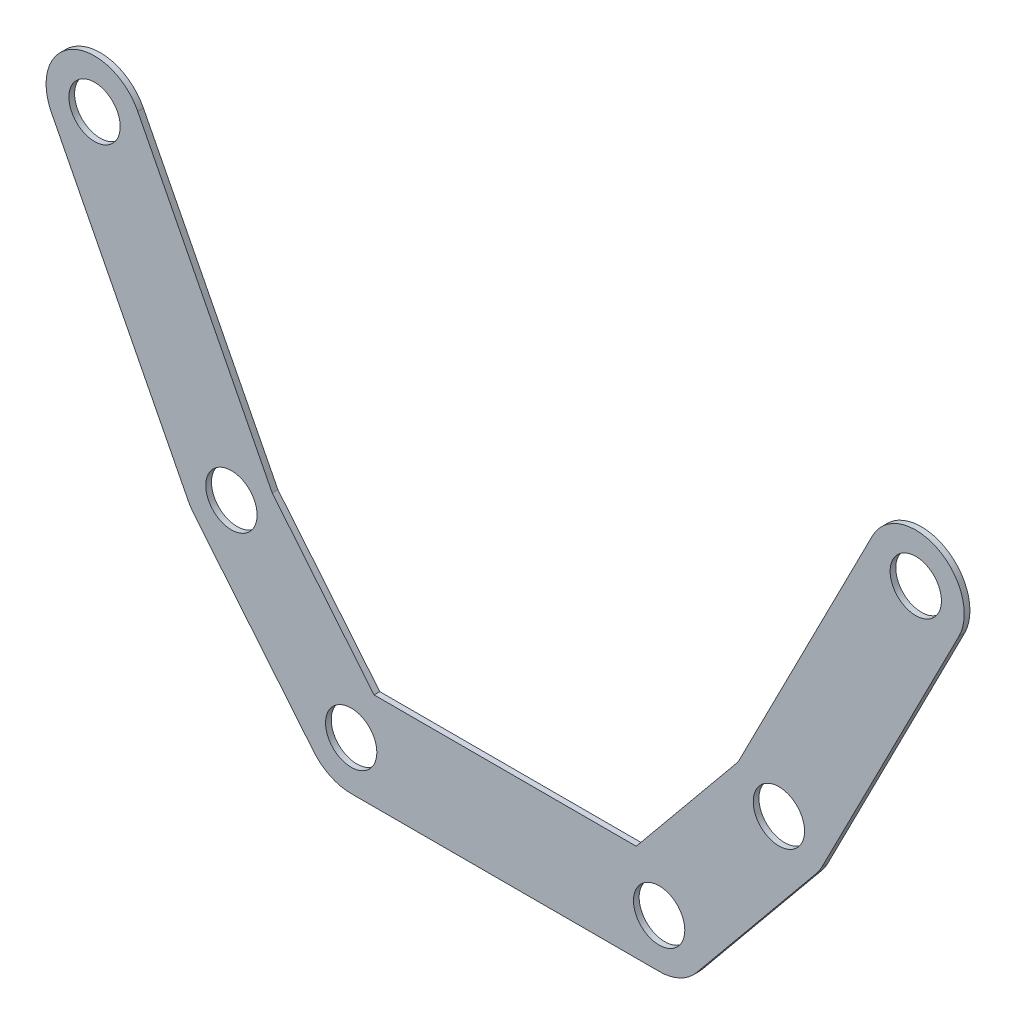
ISO-10303-21;
HEADER;
FILE_DESCRIPTION(('STEP AP214'),'2;1');
FILE_NAME('part.step','',(''),(''),'','','');
FILE_SCHEMA(('AUTOMOTIVE_DESIGN { 1 0 10303 214 1 1 1 1 }'));
ENDSEC;
DATA;
#1=APPLICATION_CONTEXT('core data for automotive mechanical design processes');
#2=APPLICATION_PROTOCOL_DEFINITION('international standard','automotive_design',2000,#1);
#3=PRODUCT_CONTEXT('',#1,'mechanical');
#4=PRODUCT('Part','Part','',(#3));
#5=PRODUCT_RELATED_PRODUCT_CATEGORY('part','',(#4));
#6=PRODUCT_DEFINITION_FORMATION('','',#4);
#7=PRODUCT_DEFINITION_CONTEXT('part definition',#1,'design');
#8=PRODUCT_DEFINITION('design','',#6,#7);
#9=PRODUCT_DEFINITION_SHAPE('','',#8);
#10=(LENGTH_UNIT() NAMED_UNIT(*) SI_UNIT(.MILLI.,.METRE.));
#11=(NAMED_UNIT(*) PLANE_ANGLE_UNIT() SI_UNIT($,.RADIAN.));
#12=(NAMED_UNIT(*) SI_UNIT($,.STERADIAN.) SOLID_ANGLE_UNIT());
#13=UNCERTAINTY_MEASURE_WITH_UNIT(LENGTH_MEASURE(1.E-05),#10,'distance_accuracy_value','');
#14=(GEOMETRIC_REPRESENTATION_CONTEXT(3) GLOBAL_UNCERTAINTY_ASSIGNED_CONTEXT((#13)) GLOBAL_UNIT_ASSIGNED_CONTEXT((#10,
#11,#12)) REPRESENTATION_CONTEXT('',''));
#15=CARTESIAN_POINT('',(0.,0.,0.));
#16=DIRECTION('',(0.,0.,1.));
#17=DIRECTION('',(1.,0.,0.));
#18=AXIS2_PLACEMENT_3D('',#15,#16,#17);
#19=CARTESIAN_POINT('',(228.6,230.279185300966,3.175));
#20=DIRECTION('',(0.,0.,1.));
#21=DIRECTION('',(1.,0.,0.));
#22=AXIS2_PLACEMENT_3D('',#19,#20,#21);
#23=PLANE('',#22);
#24=CARTESIAN_POINT('',(152.4,81.1151464038844,3.175));
#25=DIRECTION('',(0.,0.,1.));
#26=DIRECTION('',(1.,0.,0.));
#27=AXIS2_PLACEMENT_3D('',#24,#25,#26);
#28=CIRCLE('',#27,14.2875);
#29=CARTESIAN_POINT('',(166.6875,81.1151464038844,3.175));
#30=VERTEX_POINT('',#29);
#31=EDGE_CURVE('E410',#30,#30,#28,.T.);
#32=ORIENTED_EDGE('',*,*,#31,.F.);
#33=EDGE_LOOP('',(#32));
#34=FACE_BOUND('',#33,.T.);
#35=CARTESIAN_POINT('',(-85.725,0.,3.175));
#36=DIRECTION('',(0.,0.,1.));
#37=DIRECTION('',(1.,0.,0.));
#38=AXIS2_PLACEMENT_3D('',#35,#36,#37);
#39=CIRCLE('',#38,14.2875);
#40=CARTESIAN_POINT('',(-71.4375,0.,3.175));
#41=VERTEX_POINT('',#40);
#42=EDGE_CURVE('E426',#41,#41,#39,.T.);
#43=ORIENTED_EDGE('',*,*,#42,.F.);
#44=EDGE_LOOP('',(#43));
#45=FACE_BOUND('',#44,.T.);
#46=CARTESIAN_POINT('',(-228.6,230.279185300966,3.175));
#47=DIRECTION('',(0.,0.,1.));
#48=DIRECTION('',(1.,0.,0.));
#49=AXIS2_PLACEMENT_3D('',#46,#47,#48);
#50=CIRCLE('',#49,14.2875);
#51=CARTESIAN_POINT('',(-214.3125,230.279185300966,3.175));
#52=VERTEX_POINT('',#51);
#53=EDGE_CURVE('E200',#52,#52,#50,.T.);
#54=ORIENTED_EDGE('',*,*,#53,.F.);
#55=EDGE_LOOP('',(#54));
#56=FACE_BOUND('',#55,.T.);
#57=DIRECTION('',(-0.634993589588524,0.772517405099381,0.));
#58=VECTOR('',#57,1.);
#59=CARTESIAN_POINT('',(-129.696163279428,95.9946524740899,3.175));
#60=LINE('',#59,#58);
#61=CARTESIAN_POINT('',(-72.9736879441732,26.9875,3.175));
#62=VERTEX_POINT('',#61);
#63=CARTESIAN_POINT('',(-129.696163279428,95.9946524740899,3.175));
#64=VERTEX_POINT('',#63);
#65=EDGE_CURVE('E242',#62,#64,#60,.T.);
#66=ORIENTED_EDGE('',*,*,#65,.T.);
#67=DIRECTION('',(-0.454924558344074,0.890529980525894,0.));
#68=VECTOR('',#67,1.);
#69=CARTESIAN_POINT('',(-204.566822150557,242.556461819276,3.175));
#70=LINE('',#69,#68);
#71=CARTESIAN_POINT('',(-204.566822150557,242.556461819276,3.175));
#72=VERTEX_POINT('',#71);
#73=EDGE_CURVE('E130',#64,#72,#70,.T.);
#74=ORIENTED_EDGE('',*,*,#73,.T.);
#75=CARTESIAN_POINT('',(-228.6,230.279185300966,3.175));
#76=DIRECTION('',(0.,0.,1.));
#77=DIRECTION('',(1.,0.,0.));
#78=AXIS2_PLACEMENT_3D('',#75,#76,#77);
#79=CIRCLE('',#78,26.9875);
#80=CARTESIAN_POINT('',(-252.633177849443,218.001908782655,3.175));
#81=VERTEX_POINT('',#80);
#82=EDGE_CURVE('E295',#72,#81,#79,.T.);
#83=ORIENTED_EDGE('',*,*,#82,.T.);
#84=DIRECTION('',(0.454924558344075,-0.890529980525894,0.));
#85=VECTOR('',#84,1.);
#86=CARTESIAN_POINT('',(-252.633177849443,218.001908782655,3.175));
#87=LINE('',#86,#85);
#88=CARTESIAN_POINT('',(-176.433177849443,68.8378698855736,3.175));
#89=VERTEX_POINT('',#88);
#90=EDGE_CURVE('E315',#81,#89,#87,.T.);
#91=ORIENTED_EDGE('',*,*,#90,.T.);
#92=CARTESIAN_POINT('',(-152.4,81.1151464038844,3.175));
#93=DIRECTION('',(0.,0.,1.));
#94=DIRECTION('',(1.,0.,0.));
#95=AXIS2_PLACEMENT_3D('',#92,#93,#94);
#96=CIRCLE('',#95,26.9875);
#97=CARTESIAN_POINT('',(-173.24831347012,63.9782569048641,3.175));
#98=VERTEX_POINT('',#97);
#99=EDGE_CURVE('E311',#89,#98,#96,.T.);
#100=ORIENTED_EDGE('',*,*,#99,.T.);
#101=DIRECTION('',(0.634993589588525,-0.772517405099381,0.));
#102=VECTOR('',#101,1.);
#103=CARTESIAN_POINT('',(-173.24831347012,63.9782569048641,3.175));
#104=LINE('',#103,#102);
#105=CARTESIAN_POINT('',(-106.57331347012,-17.1368894990203,3.175));
#106=VERTEX_POINT('',#105);
#107=EDGE_CURVE('E314',#98,#106,#104,.T.);
#108=ORIENTED_EDGE('',*,*,#107,.T.);
#109=CARTESIAN_POINT('',(-85.725,0.,3.175));
#110=DIRECTION('',(0.,0.,1.));
#111=DIRECTION('',(1.,0.,0.));
#112=AXIS2_PLACEMENT_3D('',#109,#110,#111);
#113=CIRCLE('',#112,26.9875);
#114=CARTESIAN_POINT('',(-85.725,-26.9875,3.175));
#115=VERTEX_POINT('',#114);
#116=EDGE_CURVE('E319',#106,#115,#113,.T.);
#117=ORIENTED_EDGE('',*,*,#116,.T.);
#118=DIRECTION('',(1.,0.,0.));
#119=VECTOR('',#118,1.);
#120=CARTESIAN_POINT('',(-85.725,-26.9875,3.175));
#121=LINE('',#120,#119);
#122=CARTESIAN_POINT('',(85.725,-26.9875,3.175));
#123=VERTEX_POINT('',#122);
#124=EDGE_CURVE('E326',#115,#123,#121,.T.);
#125=ORIENTED_EDGE('',*,*,#124,.T.);
#126=CARTESIAN_POINT('',(85.725,0.,3.175));
#127=DIRECTION('',(0.,0.,1.));
#128=DIRECTION('',(1.,0.,0.));
#129=AXIS2_PLACEMENT_3D('',#126,#127,#128);
#130=CIRCLE('',#129,26.9875);
#131=CARTESIAN_POINT('',(106.57331347012,-17.1368894990203,3.175));
#132=VERTEX_POINT('',#131);
#133=EDGE_CURVE('E329',#123,#132,#130,.T.);
#134=ORIENTED_EDGE('',*,*,#133,.T.);
#135=DIRECTION('',(0.634993589588524,0.772517405099381,0.));
#136=VECTOR('',#135,1.);
#137=CARTESIAN_POINT('',(106.57331347012,-17.1368894990203,3.175));
#138=LINE('',#137,#136);
#139=CARTESIAN_POINT('',(173.24831347012,63.9782569048641,3.175));
#140=VERTEX_POINT('',#139);
#141=EDGE_CURVE('E332',#132,#140,#138,.T.);
#142=ORIENTED_EDGE('',*,*,#141,.T.);
#143=CARTESIAN_POINT('',(152.4,81.1151464038844,3.175));
#144=DIRECTION('',(0.,0.,1.));
#145=DIRECTION('',(1.,0.,0.));
#146=AXIS2_PLACEMENT_3D('',#143,#144,#145);
#147=CIRCLE('',#146,26.9875);
#148=CARTESIAN_POINT('',(176.433177849443,68.8378698855737,3.175));
#149=VERTEX_POINT('',#148);
#150=EDGE_CURVE('E335',#140,#149,#147,.T.);
#151=ORIENTED_EDGE('',*,*,#150,.T.);
#152=DIRECTION('',(0.454924558344075,0.890529980525894,0.));
#153=VECTOR('',#152,1.);
#154=CARTESIAN_POINT('',(176.433177849443,68.8378698855737,3.175));
#155=LINE('',#154,#153);
#156=CARTESIAN_POINT('',(252.633177849442,218.001908782655,3.175));
#157=VERTEX_POINT('',#156);
#158=EDGE_CURVE('E338',#149,#157,#155,.T.);
#159=ORIENTED_EDGE('',*,*,#158,.T.);
#160=CARTESIAN_POINT('',(228.6,230.279185300966,3.175));
#161=DIRECTION('',(0.,0.,1.));
#162=DIRECTION('',(1.,0.,0.));
#163=AXIS2_PLACEMENT_3D('',#160,#161,#162);
#164=CIRCLE('',#163,26.9875);
#165=CARTESIAN_POINT('',(204.566822150557,242.556461819276,3.175));
#166=VERTEX_POINT('',#165);
#167=EDGE_CURVE('E173',#157,#166,#164,.T.);
#168=ORIENTED_EDGE('',*,*,#167,.T.);
#169=DIRECTION('',(-0.454924558344075,-0.890529980525893,0.));
#170=VECTOR('',#169,1.);
#171=CARTESIAN_POINT('',(204.566822150557,242.556461819276,3.175));
#172=LINE('',#171,#170);
#173=CARTESIAN_POINT('',(129.696163279427,95.994652474088,3.175));
#174=VERTEX_POINT('',#173);
#175=EDGE_CURVE('E167',#166,#174,#172,.T.);
#176=ORIENTED_EDGE('',*,*,#175,.T.);
#177=DIRECTION('',(-0.634993589588526,-0.772517405099379,0.));
#178=VECTOR('',#177,1.);
#179=CARTESIAN_POINT('',(72.9736879441733,26.9875,3.175));
#180=LINE('',#179,#178);
#181=CARTESIAN_POINT('',(72.9736879441733,26.9875,3.175));
#182=VERTEX_POINT('',#181);
#183=EDGE_CURVE('E171',#174,#182,#180,.T.);
#184=ORIENTED_EDGE('',*,*,#183,.T.);
#185=DIRECTION('',(-1.,0.,0.));
#186=VECTOR('',#185,1.);
#187=CARTESIAN_POINT('',(-72.9736879441732,26.9875,3.175));
#188=LINE('',#187,#186);
#189=EDGE_CURVE('E63',#182,#62,#188,.T.);
#190=ORIENTED_EDGE('',*,*,#189,.T.);
#191=EDGE_LOOP('',(#66,#74,#83,#91,#100,#108,#117,#125,#134,#142,#151,#159,#168,#176,#184,#190));
#192=FACE_BOUND('',#191,.T.);
#193=CARTESIAN_POINT('',(-152.4,81.1151464038844,3.175));
#194=DIRECTION('',(0.,0.,1.));
#195=DIRECTION('',(1.,0.,0.));
#196=AXIS2_PLACEMENT_3D('',#193,#194,#195);
#197=CIRCLE('',#196,14.2875);
#198=CARTESIAN_POINT('',(-138.1125,81.1151464038844,3.175));
#199=VERTEX_POINT('',#198);
#200=EDGE_CURVE('E434',#199,#199,#197,.T.);
#201=ORIENTED_EDGE('',*,*,#200,.F.);
#202=EDGE_LOOP('',(#201));
#203=FACE_BOUND('',#202,.T.);
#204=CARTESIAN_POINT('',(85.725,0.,3.175));
#205=DIRECTION('',(0.,0.,1.));
#206=DIRECTION('',(1.,0.,0.));
#207=AXIS2_PLACEMENT_3D('',#204,#205,#206);
#208=CIRCLE('',#207,14.2875);
#209=CARTESIAN_POINT('',(100.0125,0.,3.175));
#210=VERTEX_POINT('',#209);
#211=EDGE_CURVE('E418',#210,#210,#208,.T.);
#212=ORIENTED_EDGE('',*,*,#211,.F.);
#213=EDGE_LOOP('',(#212));
#214=FACE_BOUND('',#213,.T.);
#215=CARTESIAN_POINT('',(228.6,230.279185300966,3.175));
#216=DIRECTION('',(0.,0.,1.));
#217=DIRECTION('',(1.,0.,0.));
#218=AXIS2_PLACEMENT_3D('',#215,#216,#217);
#219=CIRCLE('',#218,14.2875);
#220=CARTESIAN_POINT('',(242.8875,230.279185300966,3.175));
#221=VERTEX_POINT('',#220);
#222=EDGE_CURVE('E399',#221,#221,#219,.T.);
#223=ORIENTED_EDGE('',*,*,#222,.F.);
#224=EDGE_LOOP('',(#223));
#225=FACE_BOUND('',#224,.T.);
#226=ADVANCED_FACE('F45',(#34,#45,#56,#192,#203,#214,#225),#23,.T.);
#227=CARTESIAN_POINT('',(228.6,230.279185300966,0.));
#228=DIRECTION('',(0.,0.,1.));
#229=DIRECTION('',(1.,0.,0.));
#230=AXIS2_PLACEMENT_3D('',#227,#228,#229);
#231=PLANE('',#230);
#232=DIRECTION('',(-0.634993589588524,0.772517405099381,0.));
#233=VECTOR('',#232,1.);
#234=CARTESIAN_POINT('',(-129.696163279428,95.9946524740899,0.));
#235=LINE('',#234,#233);
#236=CARTESIAN_POINT('',(-72.9736879441732,26.9875,0.));
#237=VERTEX_POINT('',#236);
#238=CARTESIAN_POINT('',(-129.696163279428,95.9946524740899,0.));
#239=VERTEX_POINT('',#238);
#240=EDGE_CURVE('E195',#237,#239,#235,.T.);
#241=ORIENTED_EDGE('',*,*,#240,.F.);
#242=DIRECTION('',(-1.,0.,0.));
#243=VECTOR('',#242,1.);
#244=CARTESIAN_POINT('',(-72.9736879441732,26.9875,0.));
#245=LINE('',#244,#243);
#246=CARTESIAN_POINT('',(72.9736879441733,26.9875,0.));
#247=VERTEX_POINT('',#246);
#248=EDGE_CURVE('E122',#247,#237,#245,.T.);
#249=ORIENTED_EDGE('',*,*,#248,.F.);
#250=DIRECTION('',(-0.634993589588526,-0.772517405099379,0.));
#251=VECTOR('',#250,1.);
#252=CARTESIAN_POINT('',(72.9736879441733,26.9875,0.));
#253=LINE('',#252,#251);
#254=CARTESIAN_POINT('',(129.696163279427,95.994652474088,0.));
#255=VERTEX_POINT('',#254);
#256=EDGE_CURVE('E116',#255,#247,#253,.T.);
#257=ORIENTED_EDGE('',*,*,#256,.F.);
#258=DIRECTION('',(-0.454924558344075,-0.890529980525893,0.));
#259=VECTOR('',#258,1.);
#260=CARTESIAN_POINT('',(204.566822150557,242.556461819276,0.));
#261=LINE('',#260,#259);
#262=CARTESIAN_POINT('',(204.566822150557,242.556461819276,0.));
#263=VERTEX_POINT('',#262);
#264=EDGE_CURVE('E182',#263,#255,#261,.T.);
#265=ORIENTED_EDGE('',*,*,#264,.F.);
#266=CARTESIAN_POINT('',(228.6,230.279185300966,0.));
#267=DIRECTION('',(0.,0.,1.));
#268=DIRECTION('',(1.,0.,0.));
#269=AXIS2_PLACEMENT_3D('',#266,#267,#268);
#270=CIRCLE('',#269,26.9875);
#271=CARTESIAN_POINT('',(252.633177849442,218.001908782655,0.));
#272=VERTEX_POINT('',#271);
#273=EDGE_CURVE('E233',#272,#263,#270,.T.);
#274=ORIENTED_EDGE('',*,*,#273,.F.);
#275=DIRECTION('',(0.454924558344075,0.890529980525894,0.));
#276=VECTOR('',#275,1.);
#277=CARTESIAN_POINT('',(176.433177849443,68.8378698855737,0.));
#278=LINE('',#277,#276);
#279=CARTESIAN_POINT('',(176.433177849443,68.8378698855737,0.));
#280=VERTEX_POINT('',#279);
#281=EDGE_CURVE('E230',#280,#272,#278,.T.);
#282=ORIENTED_EDGE('',*,*,#281,.F.);
#283=CARTESIAN_POINT('',(152.4,81.1151464038844,0.));
#284=DIRECTION('',(0.,0.,1.));
#285=DIRECTION('',(1.,0.,0.));
#286=AXIS2_PLACEMENT_3D('',#283,#284,#285);
#287=CIRCLE('',#286,26.9875);
#288=CARTESIAN_POINT('',(173.24831347012,63.9782569048641,0.));
#289=VERTEX_POINT('',#288);
#290=EDGE_CURVE('E227',#289,#280,#287,.T.);
#291=ORIENTED_EDGE('',*,*,#290,.F.);
#292=DIRECTION('',(0.634993589588524,0.772517405099381,0.));
#293=VECTOR('',#292,1.);
#294=CARTESIAN_POINT('',(106.57331347012,-17.1368894990203,0.));
#295=LINE('',#294,#293);
#296=CARTESIAN_POINT('',(106.57331347012,-17.1368894990203,0.));
#297=VERTEX_POINT('',#296);
#298=EDGE_CURVE('E224',#297,#289,#295,.T.);
#299=ORIENTED_EDGE('',*,*,#298,.F.);
#300=CARTESIAN_POINT('',(85.725,0.,0.));
#301=DIRECTION('',(0.,0.,1.));
#302=DIRECTION('',(1.,0.,0.));
#303=AXIS2_PLACEMENT_3D('',#300,#301,#302);
#304=CIRCLE('',#303,26.9875);
#305=CARTESIAN_POINT('',(85.725,-26.9875,0.));
#306=VERTEX_POINT('',#305);
#307=EDGE_CURVE('E221',#306,#297,#304,.T.);
#308=ORIENTED_EDGE('',*,*,#307,.F.);
#309=DIRECTION('',(1.,0.,0.));
#310=VECTOR('',#309,1.);
#311=CARTESIAN_POINT('',(-85.725,-26.9875,0.));
#312=LINE('',#311,#310);
#313=CARTESIAN_POINT('',(-85.725,-26.9875,0.));
#314=VERTEX_POINT('',#313);
#315=EDGE_CURVE('E218',#314,#306,#312,.T.);
#316=ORIENTED_EDGE('',*,*,#315,.F.);
#317=CARTESIAN_POINT('',(-85.725,0.,0.));
#318=DIRECTION('',(0.,0.,1.));
#319=DIRECTION('',(1.,0.,0.));
#320=AXIS2_PLACEMENT_3D('',#317,#318,#319);
#321=CIRCLE('',#320,26.9875);
#322=CARTESIAN_POINT('',(-106.57331347012,-17.1368894990203,0.));
#323=VERTEX_POINT('',#322);
#324=EDGE_CURVE('E215',#323,#314,#321,.T.);
#325=ORIENTED_EDGE('',*,*,#324,.F.);
#326=DIRECTION('',(0.634993589588525,-0.772517405099381,0.));
#327=VECTOR('',#326,1.);
#328=CARTESIAN_POINT('',(-173.24831347012,63.9782569048641,0.));
#329=LINE('',#328,#327);
#330=CARTESIAN_POINT('',(-173.24831347012,63.9782569048641,0.));
#331=VERTEX_POINT('',#330);
#332=EDGE_CURVE('E212',#331,#323,#329,.T.);
#333=ORIENTED_EDGE('',*,*,#332,.F.);
#334=CARTESIAN_POINT('',(-152.4,81.1151464038844,0.));
#335=DIRECTION('',(0.,0.,1.));
#336=DIRECTION('',(1.,0.,0.));
#337=AXIS2_PLACEMENT_3D('',#334,#335,#336);
#338=CIRCLE('',#337,26.9875);
#339=CARTESIAN_POINT('',(-176.433177849443,68.8378698855736,0.));
#340=VERTEX_POINT('',#339);
#341=EDGE_CURVE('E209',#340,#331,#338,.T.);
#342=ORIENTED_EDGE('',*,*,#341,.F.);
#343=DIRECTION('',(0.454924558344075,-0.890529980525894,0.));
#344=VECTOR('',#343,1.);
#345=CARTESIAN_POINT('',(-252.633177849443,218.001908782655,0.));
#346=LINE('',#345,#344);
#347=CARTESIAN_POINT('',(-252.633177849443,218.001908782655,0.));
#348=VERTEX_POINT('',#347);
#349=EDGE_CURVE('E206',#348,#340,#346,.T.);
#350=ORIENTED_EDGE('',*,*,#349,.F.);
#351=CARTESIAN_POINT('',(-228.6,230.279185300966,0.));
#352=DIRECTION('',(0.,0.,1.));
#353=DIRECTION('',(1.,0.,0.));
#354=AXIS2_PLACEMENT_3D('',#351,#352,#353);
#355=CIRCLE('',#354,26.9875);
#356=CARTESIAN_POINT('',(-204.566822150557,242.556461819276,0.));
#357=VERTEX_POINT('',#356);
#358=EDGE_CURVE('E203',#357,#348,#355,.T.);
#359=ORIENTED_EDGE('',*,*,#358,.F.);
#360=DIRECTION('',(-0.454924558344074,0.890529980525894,0.));
#361=VECTOR('',#360,1.);
#362=CARTESIAN_POINT('',(-204.566822150557,242.556461819276,0.));
#363=LINE('',#362,#361);
#364=EDGE_CURVE('E199',#239,#357,#363,.T.);
#365=ORIENTED_EDGE('',*,*,#364,.F.);
#366=EDGE_LOOP('',(#241,#249,#257,#265,#274,#282,#291,#299,#308,#316,#325,#333,#342,#350,#359,#365));
#367=FACE_BOUND('',#366,.T.);
#368=CARTESIAN_POINT('',(-228.6,230.279185300966,0.));
#369=DIRECTION('',(0.,0.,1.));
#370=DIRECTION('',(1.,0.,0.));
#371=AXIS2_PLACEMENT_3D('',#368,#369,#370);
#372=CIRCLE('',#371,14.2875);
#373=CARTESIAN_POINT('',(-214.3125,230.279185300966,0.));
#374=VERTEX_POINT('',#373);
#375=EDGE_CURVE('E438',#374,#374,#372,.T.);
#376=ORIENTED_EDGE('',*,*,#375,.T.);
#377=EDGE_LOOP('',(#376));
#378=FACE_BOUND('',#377,.T.);
#379=CARTESIAN_POINT('',(-152.4,81.1151464038844,0.));
#380=DIRECTION('',(0.,0.,1.));
#381=DIRECTION('',(1.,0.,0.));
#382=AXIS2_PLACEMENT_3D('',#379,#380,#381);
#383=CIRCLE('',#382,14.2875);
#384=CARTESIAN_POINT('',(-138.1125,81.1151464038844,0.));
#385=VERTEX_POINT('',#384);
#386=EDGE_CURVE('E430',#385,#385,#383,.T.);
#387=ORIENTED_EDGE('',*,*,#386,.T.);
#388=EDGE_LOOP('',(#387));
#389=FACE_BOUND('',#388,.T.);
#390=CARTESIAN_POINT('',(-85.725,0.,0.));
#391=DIRECTION('',(0.,0.,1.));
#392=DIRECTION('',(1.,0.,0.));
#393=AXIS2_PLACEMENT_3D('',#390,#391,#392);
#394=CIRCLE('',#393,14.2875);
#395=CARTESIAN_POINT('',(-71.4375,0.,0.));
#396=VERTEX_POINT('',#395);
#397=EDGE_CURVE('E422',#396,#396,#394,.T.);
#398=ORIENTED_EDGE('',*,*,#397,.T.);
#399=EDGE_LOOP('',(#398));
#400=FACE_BOUND('',#399,.T.);
#401=CARTESIAN_POINT('',(85.725,0.,0.));
#402=DIRECTION('',(0.,0.,1.));
#403=DIRECTION('',(1.,0.,0.));
#404=AXIS2_PLACEMENT_3D('',#401,#402,#403);
#405=CIRCLE('',#404,14.2875);
#406=CARTESIAN_POINT('',(100.0125,0.,0.));
#407=VERTEX_POINT('',#406);
#408=EDGE_CURVE('E414',#407,#407,#405,.T.);
#409=ORIENTED_EDGE('',*,*,#408,.T.);
#410=EDGE_LOOP('',(#409));
#411=FACE_BOUND('',#410,.T.);
#412=CARTESIAN_POINT('',(152.4,81.1151464038844,0.));
#413=DIRECTION('',(0.,0.,1.));
#414=DIRECTION('',(1.,0.,0.));
#415=AXIS2_PLACEMENT_3D('',#412,#413,#414);
#416=CIRCLE('',#415,14.2875);
#417=CARTESIAN_POINT('',(166.6875,81.1151464038844,0.));
#418=VERTEX_POINT('',#417);
#419=EDGE_CURVE('E407',#418,#418,#416,.T.);
#420=ORIENTED_EDGE('',*,*,#419,.T.);
#421=EDGE_LOOP('',(#420));
#422=FACE_BOUND('',#421,.T.);
#423=CARTESIAN_POINT('',(228.6,230.279185300966,0.));
#424=DIRECTION('',(0.,0.,1.));
#425=DIRECTION('',(1.,0.,0.));
#426=AXIS2_PLACEMENT_3D('',#423,#424,#425);
#427=CIRCLE('',#426,14.2875);
#428=CARTESIAN_POINT('',(242.8875,230.279185300966,0.));
#429=VERTEX_POINT('',#428);
#430=EDGE_CURVE('E402',#429,#429,#427,.T.);
#431=ORIENTED_EDGE('',*,*,#430,.T.);
#432=EDGE_LOOP('',(#431));
#433=FACE_BOUND('',#432,.T.);
#434=ADVANCED_FACE('F299',(#367,#378,#389,#400,#411,#422,#433),#231,.F.);
#435=CARTESIAN_POINT('',(-129.696163279428,95.9946524740899,3.175));
#436=DIRECTION('',(-0.772517405099381,-0.634993589588524,0.));
#437=DIRECTION('',(0.634993589588524,-0.772517405099381,0.));
#438=AXIS2_PLACEMENT_3D('',#435,#436,#437);
#439=PLANE('',#438);
#440=ORIENTED_EDGE('',*,*,#240,.T.);
#441=DIRECTION('',(0.,0.,-1.));
#442=VECTOR('',#441,1.);
#443=CARTESIAN_POINT('',(-129.696163279428,95.9946524740899,3.175));
#444=LINE('',#443,#442);
#445=EDGE_CURVE('E11',#64,#239,#444,.T.);
#446=ORIENTED_EDGE('',*,*,#445,.F.);
#447=ORIENTED_EDGE('',*,*,#65,.F.);
#448=DIRECTION('',(0.,0.,-1.));
#449=VECTOR('',#448,1.);
#450=CARTESIAN_POINT('',(-72.9736879441732,26.9875,3.175));
#451=LINE('',#450,#449);
#452=EDGE_CURVE('E191',#62,#237,#451,.T.);
#453=ORIENTED_EDGE('',*,*,#452,.T.);
#454=EDGE_LOOP('',(#440,#446,#447,#453));
#455=FACE_BOUND('',#454,.T.);
#456=ADVANCED_FACE('F47',(#455),#439,.F.);
#457=CARTESIAN_POINT('',(-204.566822150557,242.556461819276,3.175));
#458=DIRECTION('',(-0.890529980525894,-0.454924558344074,0.));
#459=DIRECTION('',(0.454924558344074,-0.890529980525894,0.));
#460=AXIS2_PLACEMENT_3D('',#457,#458,#459);
#461=PLANE('',#460);
#462=ORIENTED_EDGE('',*,*,#364,.T.);
#463=DIRECTION('',(0.,0.,-1.));
#464=VECTOR('',#463,1.);
#465=CARTESIAN_POINT('',(-204.566822150557,242.556461819276,3.175));
#466=LINE('',#465,#464);
#467=EDGE_CURVE('E55',#72,#357,#466,.T.);
#468=ORIENTED_EDGE('',*,*,#467,.F.);
#469=ORIENTED_EDGE('',*,*,#73,.F.);
#470=ORIENTED_EDGE('',*,*,#445,.T.);
#471=EDGE_LOOP('',(#462,#468,#469,#470));
#472=FACE_BOUND('',#471,.T.);
#473=ADVANCED_FACE('F618',(#472),#461,.F.);
#474=CARTESIAN_POINT('',(-228.6,230.279185300966,3.175));
#475=DIRECTION('',(0.,0.,-1.));
#476=DIRECTION('',(-1.,0.,0.));
#477=AXIS2_PLACEMENT_3D('',#474,#475,#476);
#478=CYLINDRICAL_SURFACE('',#477,26.9875);
#479=ORIENTED_EDGE('',*,*,#358,.T.);
#480=DIRECTION('',(0.,0.,-1.));
#481=VECTOR('',#480,1.);
#482=CARTESIAN_POINT('',(-252.633177849443,218.001908782655,3.175));
#483=LINE('',#482,#481);
#484=EDGE_CURVE('E285',#81,#348,#483,.T.);
#485=ORIENTED_EDGE('',*,*,#484,.F.);
#486=ORIENTED_EDGE('',*,*,#82,.F.);
#487=ORIENTED_EDGE('',*,*,#467,.T.);
#488=EDGE_LOOP('',(#479,#485,#486,#487));
#489=FACE_BOUND('',#488,.T.);
#490=ADVANCED_FACE('F293',(#489),#478,.T.);
#491=CARTESIAN_POINT('',(-252.633177849443,218.001908782655,3.175));
#492=DIRECTION('',(0.890529980525894,0.454924558344075,0.));
#493=DIRECTION('',(-0.454924558344075,0.890529980525894,0.));
#494=AXIS2_PLACEMENT_3D('',#491,#492,#493);
#495=PLANE('',#494);
#496=ORIENTED_EDGE('',*,*,#349,.T.);
#497=DIRECTION('',(0.,0.,-1.));
#498=VECTOR('',#497,1.);
#499=CARTESIAN_POINT('',(-176.433177849443,68.8378698855736,3.175));
#500=LINE('',#499,#498);
#501=EDGE_CURVE('E281',#89,#340,#500,.T.);
#502=ORIENTED_EDGE('',*,*,#501,.F.);
#503=ORIENTED_EDGE('',*,*,#90,.F.);
#504=ORIENTED_EDGE('',*,*,#484,.T.);
#505=EDGE_LOOP('',(#496,#502,#503,#504));
#506=FACE_BOUND('',#505,.T.);
#507=ADVANCED_FACE('F305',(#506),#495,.F.);
#508=CARTESIAN_POINT('',(-152.4,81.1151464038844,3.175));
#509=DIRECTION('',(0.,0.,-1.));
#510=DIRECTION('',(-1.,0.,0.));
#511=AXIS2_PLACEMENT_3D('',#508,#509,#510);
#512=CYLINDRICAL_SURFACE('',#511,26.9875);
#513=ORIENTED_EDGE('',*,*,#341,.T.);
#514=DIRECTION('',(0.,0.,-1.));
#515=VECTOR('',#514,1.);
#516=CARTESIAN_POINT('',(-173.24831347012,63.9782569048641,3.175));
#517=LINE('',#516,#515);
#518=EDGE_CURVE('E277',#98,#331,#517,.T.);
#519=ORIENTED_EDGE('',*,*,#518,.F.);
#520=ORIENTED_EDGE('',*,*,#99,.F.);
#521=ORIENTED_EDGE('',*,*,#501,.T.);
#522=EDGE_LOOP('',(#513,#519,#520,#521));
#523=FACE_BOUND('',#522,.T.);
#524=ADVANCED_FACE('F309',(#523),#512,.T.);
#525=CARTESIAN_POINT('',(-173.24831347012,63.9782569048641,3.175));
#526=DIRECTION('',(0.772517405099381,0.634993589588524,0.));
#527=DIRECTION('',(-0.634993589588524,0.772517405099381,0.));
#528=AXIS2_PLACEMENT_3D('',#525,#526,#527);
#529=PLANE('',#528);
#530=ORIENTED_EDGE('',*,*,#332,.T.);
#531=DIRECTION('',(0.,0.,-1.));
#532=VECTOR('',#531,1.);
#533=CARTESIAN_POINT('',(-106.57331347012,-17.1368894990203,3.175));
#534=LINE('',#533,#532);
#535=EDGE_CURVE('E273',#106,#323,#534,.T.);
#536=ORIENTED_EDGE('',*,*,#535,.F.);
#537=ORIENTED_EDGE('',*,*,#107,.F.);
#538=ORIENTED_EDGE('',*,*,#518,.T.);
#539=EDGE_LOOP('',(#530,#536,#537,#538));
#540=FACE_BOUND('',#539,.T.);
#541=ADVANCED_FACE('F583',(#540),#529,.F.);
#542=CARTESIAN_POINT('',(-85.725,0.,3.175));
#543=DIRECTION('',(0.,0.,-1.));
#544=DIRECTION('',(-1.,0.,0.));
#545=AXIS2_PLACEMENT_3D('',#542,#543,#544);
#546=CYLINDRICAL_SURFACE('',#545,26.9875);
#547=ORIENTED_EDGE('',*,*,#324,.T.);
#548=DIRECTION('',(0.,0.,-1.));
#549=VECTOR('',#548,1.);
#550=CARTESIAN_POINT('',(-85.725,-26.9875,3.175));
#551=LINE('',#550,#549);
#552=EDGE_CURVE('E269',#115,#314,#551,.T.);
#553=ORIENTED_EDGE('',*,*,#552,.F.);
#554=ORIENTED_EDGE('',*,*,#116,.F.);
#555=ORIENTED_EDGE('',*,*,#535,.T.);
#556=EDGE_LOOP('',(#547,#553,#554,#555));
#557=FACE_BOUND('',#556,.T.);
#558=ADVANCED_FACE('F573',(#557),#546,.T.);
#559=CARTESIAN_POINT('',(-85.725,-26.9875,3.175));
#560=DIRECTION('',(0.,1.,0.));
#561=DIRECTION('',(-1.,0.,0.));
#562=AXIS2_PLACEMENT_3D('',#559,#560,#561);
#563=PLANE('',#562);
#564=ORIENTED_EDGE('',*,*,#315,.T.);
#565=DIRECTION('',(0.,0.,-1.));
#566=VECTOR('',#565,1.);
#567=CARTESIAN_POINT('',(85.725,-26.9875,3.175));
#568=LINE('',#567,#566);
#569=EDGE_CURVE('E265',#123,#306,#568,.T.);
#570=ORIENTED_EDGE('',*,*,#569,.F.);
#571=ORIENTED_EDGE('',*,*,#124,.F.);
#572=ORIENTED_EDGE('',*,*,#552,.T.);
#573=EDGE_LOOP('',(#564,#570,#571,#572));
#574=FACE_BOUND('',#573,.T.);
#575=ADVANCED_FACE('F563',(#574),#563,.F.);
#576=CARTESIAN_POINT('',(85.725,0.,3.175));
#577=DIRECTION('',(0.,0.,-1.));
#578=DIRECTION('',(-1.,0.,0.));
#579=AXIS2_PLACEMENT_3D('',#576,#577,#578);
#580=CYLINDRICAL_SURFACE('',#579,26.9875);
#581=ORIENTED_EDGE('',*,*,#307,.T.);
#582=DIRECTION('',(0.,0.,-1.));
#583=VECTOR('',#582,1.);
#584=CARTESIAN_POINT('',(106.57331347012,-17.1368894990203,3.175));
#585=LINE('',#584,#583);
#586=EDGE_CURVE('E261',#132,#297,#585,.T.);
#587=ORIENTED_EDGE('',*,*,#586,.F.);
#588=ORIENTED_EDGE('',*,*,#133,.F.);
#589=ORIENTED_EDGE('',*,*,#569,.T.);
#590=EDGE_LOOP('',(#581,#587,#588,#589));
#591=FACE_BOUND('',#590,.T.);
#592=ADVANCED_FACE('F553',(#591),#580,.T.);
#593=CARTESIAN_POINT('',(106.57331347012,-17.1368894990203,3.175));
#594=DIRECTION('',(-0.772517405099381,0.634993589588524,0.));
#595=DIRECTION('',(-0.634993589588524,-0.772517405099381,0.));
#596=AXIS2_PLACEMENT_3D('',#593,#594,#595);
#597=PLANE('',#596);
#598=ORIENTED_EDGE('',*,*,#298,.T.);
#599=DIRECTION('',(0.,0.,-1.));
#600=VECTOR('',#599,1.);
#601=CARTESIAN_POINT('',(173.24831347012,63.9782569048641,3.175));
#602=LINE('',#601,#600);
#603=EDGE_CURVE('E257',#140,#289,#602,.T.);
#604=ORIENTED_EDGE('',*,*,#603,.F.);
#605=ORIENTED_EDGE('',*,*,#141,.F.);
#606=ORIENTED_EDGE('',*,*,#586,.T.);
#607=EDGE_LOOP('',(#598,#604,#605,#606));
#608=FACE_BOUND('',#607,.T.);
#609=ADVANCED_FACE('F543',(#608),#597,.F.);
#610=CARTESIAN_POINT('',(152.4,81.1151464038844,3.175));
#611=DIRECTION('',(0.,0.,-1.));
#612=DIRECTION('',(-1.,0.,0.));
#613=AXIS2_PLACEMENT_3D('',#610,#611,#612);
#614=CYLINDRICAL_SURFACE('',#613,26.9875);
#615=ORIENTED_EDGE('',*,*,#290,.T.);
#616=DIRECTION('',(0.,0.,-1.));
#617=VECTOR('',#616,1.);
#618=CARTESIAN_POINT('',(176.433177849443,68.8378698855737,3.175));
#619=LINE('',#618,#617);
#620=EDGE_CURVE('E253',#149,#280,#619,.T.);
#621=ORIENTED_EDGE('',*,*,#620,.F.);
#622=ORIENTED_EDGE('',*,*,#150,.F.);
#623=ORIENTED_EDGE('',*,*,#603,.T.);
#624=EDGE_LOOP('',(#615,#621,#622,#623));
#625=FACE_BOUND('',#624,.T.);
#626=ADVANCED_FACE('F534',(#625),#614,.T.);
#627=CARTESIAN_POINT('',(176.433177849443,68.8378698855737,3.175));
#628=DIRECTION('',(-0.890529980525894,0.454924558344075,0.));
#629=DIRECTION('',(-0.454924558344075,-0.890529980525894,0.));
#630=AXIS2_PLACEMENT_3D('',#627,#628,#629);
#631=PLANE('',#630);
#632=ORIENTED_EDGE('',*,*,#281,.T.);
#633=DIRECTION('',(0.,0.,-1.));
#634=VECTOR('',#633,1.);
#635=CARTESIAN_POINT('',(252.633177849442,218.001908782655,3.175));
#636=LINE('',#635,#634);
#637=EDGE_CURVE('E249',#157,#272,#636,.T.);
#638=ORIENTED_EDGE('',*,*,#637,.F.);
#639=ORIENTED_EDGE('',*,*,#158,.F.);
#640=ORIENTED_EDGE('',*,*,#620,.T.);
#641=EDGE_LOOP('',(#632,#638,#639,#640));
#642=FACE_BOUND('',#641,.T.);
#643=ADVANCED_FACE('F346',(#642),#631,.F.);
#644=CARTESIAN_POINT('',(228.6,230.279185300966,3.175));
#645=DIRECTION('',(0.,0.,-1.));
#646=DIRECTION('',(-1.,0.,0.));
#647=AXIS2_PLACEMENT_3D('',#644,#645,#646);
#648=CYLINDRICAL_SURFACE('',#647,26.9875);
#649=ORIENTED_EDGE('',*,*,#273,.T.);
#650=DIRECTION('',(0.,0.,-1.));
#651=VECTOR('',#650,1.);
#652=CARTESIAN_POINT('',(204.566822150557,242.556461819276,3.175));
#653=LINE('',#652,#651);
#654=EDGE_CURVE('E184',#166,#263,#653,.T.);
#655=ORIENTED_EDGE('',*,*,#654,.F.);
#656=ORIENTED_EDGE('',*,*,#167,.F.);
#657=ORIENTED_EDGE('',*,*,#637,.T.);
#658=EDGE_LOOP('',(#649,#655,#656,#657));
#659=FACE_BOUND('',#658,.T.);
#660=ADVANCED_FACE('F350',(#659),#648,.T.);
#661=CARTESIAN_POINT('',(204.566822150557,242.556461819276,3.175));
#662=DIRECTION('',(0.890529980525893,-0.454924558344075,0.));
#663=DIRECTION('',(0.454924558344076,0.890529980525893,0.));
#664=AXIS2_PLACEMENT_3D('',#661,#662,#663);
#665=PLANE('',#664);
#666=ORIENTED_EDGE('',*,*,#264,.T.);
#667=DIRECTION('',(0.,0.,-1.));
#668=VECTOR('',#667,1.);
#669=CARTESIAN_POINT('',(129.696163279427,95.994652474088,3.175));
#670=LINE('',#669,#668);
#671=EDGE_CURVE('E179',#174,#255,#670,.T.);
#672=ORIENTED_EDGE('',*,*,#671,.F.);
#673=ORIENTED_EDGE('',*,*,#175,.F.);
#674=ORIENTED_EDGE('',*,*,#654,.T.);
#675=EDGE_LOOP('',(#666,#672,#673,#674));
#676=FACE_BOUND('',#675,.T.);
#677=ADVANCED_FACE('F180',(#676),#665,.F.);
#678=CARTESIAN_POINT('',(72.9736879441733,26.9875,3.175));
#679=DIRECTION('',(0.772517405099379,-0.634993589588526,0.));
#680=DIRECTION('',(0.634993589588526,0.77251740509938,0.));
#681=AXIS2_PLACEMENT_3D('',#678,#679,#680);
#682=PLANE('',#681);
#683=ORIENTED_EDGE('',*,*,#256,.T.);
#684=DIRECTION('',(0.,0.,-1.));
#685=VECTOR('',#684,1.);
#686=CARTESIAN_POINT('',(72.9736879441733,26.9875,3.175));
#687=LINE('',#686,#685);
#688=EDGE_CURVE('E185',#182,#247,#687,.T.);
#689=ORIENTED_EDGE('',*,*,#688,.F.);
#690=ORIENTED_EDGE('',*,*,#183,.F.);
#691=ORIENTED_EDGE('',*,*,#671,.T.);
#692=EDGE_LOOP('',(#683,#689,#690,#691));
#693=FACE_BOUND('',#692,.T.);
#694=ADVANCED_FACE('F187',(#693),#682,.F.);
#695=CARTESIAN_POINT('',(-72.9736879441732,26.9875,3.175));
#696=DIRECTION('',(0.,-1.,0.));
#697=DIRECTION('',(1.,0.,0.));
#698=AXIS2_PLACEMENT_3D('',#695,#696,#697);
#699=PLANE('',#698);
#700=ORIENTED_EDGE('',*,*,#248,.T.);
#701=ORIENTED_EDGE('',*,*,#452,.F.);
#702=ORIENTED_EDGE('',*,*,#189,.F.);
#703=ORIENTED_EDGE('',*,*,#688,.T.);
#704=EDGE_LOOP('',(#700,#701,#702,#703));
#705=FACE_BOUND('',#704,.T.);
#706=ADVANCED_FACE('F354',(#705),#699,.F.);
#707=CARTESIAN_POINT('',(-228.6,230.279185300966,3.175));
#708=DIRECTION('',(0.,0.,-1.));
#709=DIRECTION('',(-1.,0.,0.));
#710=AXIS2_PLACEMENT_3D('',#707,#708,#709);
#711=CYLINDRICAL_SURFACE('',#710,14.2875);
#712=ORIENTED_EDGE('',*,*,#53,.T.);
#713=EDGE_LOOP('',(#712));
#714=FACE_BOUND('',#713,.T.);
#715=ORIENTED_EDGE('',*,*,#375,.F.);
#716=EDGE_LOOP('',(#715));
#717=FACE_BOUND('',#716,.T.);
#718=ADVANCED_FACE('F356',(#714,#717),#711,.F.);
#719=CARTESIAN_POINT('',(-152.4,81.1151464038844,3.175));
#720=DIRECTION('',(0.,0.,-1.));
#721=DIRECTION('',(-1.,0.,0.));
#722=AXIS2_PLACEMENT_3D('',#719,#720,#721);
#723=CYLINDRICAL_SURFACE('',#722,14.2875);
#724=ORIENTED_EDGE('',*,*,#200,.T.);
#725=EDGE_LOOP('',(#724));
#726=FACE_BOUND('',#725,.T.);
#727=ORIENTED_EDGE('',*,*,#386,.F.);
#728=EDGE_LOOP('',(#727));
#729=FACE_BOUND('',#728,.T.);
#730=ADVANCED_FACE('F362',(#726,#729),#723,.F.);
#731=CARTESIAN_POINT('',(-85.725,0.,3.175));
#732=DIRECTION('',(0.,0.,-1.));
#733=DIRECTION('',(-1.,0.,0.));
#734=AXIS2_PLACEMENT_3D('',#731,#732,#733);
#735=CYLINDRICAL_SURFACE('',#734,14.2875);
#736=ORIENTED_EDGE('',*,*,#42,.T.);
#737=EDGE_LOOP('',(#736));
#738=FACE_BOUND('',#737,.T.);
#739=ORIENTED_EDGE('',*,*,#397,.F.);
#740=EDGE_LOOP('',(#739));
#741=FACE_BOUND('',#740,.T.);
#742=ADVANCED_FACE('F378',(#738,#741),#735,.F.);
#743=CARTESIAN_POINT('',(85.725,0.,3.175));
#744=DIRECTION('',(0.,0.,-1.));
#745=DIRECTION('',(-1.,0.,0.));
#746=AXIS2_PLACEMENT_3D('',#743,#744,#745);
#747=CYLINDRICAL_SURFACE('',#746,14.2875);
#748=ORIENTED_EDGE('',*,*,#211,.T.);
#749=EDGE_LOOP('',(#748));
#750=FACE_BOUND('',#749,.T.);
#751=ORIENTED_EDGE('',*,*,#408,.F.);
#752=EDGE_LOOP('',(#751));
#753=FACE_BOUND('',#752,.T.);
#754=ADVANCED_FACE('F382',(#750,#753),#747,.F.);
#755=CARTESIAN_POINT('',(152.4,81.1151464038844,3.175));
#756=DIRECTION('',(0.,0.,-1.));
#757=DIRECTION('',(-1.,0.,0.));
#758=AXIS2_PLACEMENT_3D('',#755,#756,#757);
#759=CYLINDRICAL_SURFACE('',#758,14.2875);
#760=ORIENTED_EDGE('',*,*,#31,.T.);
#761=EDGE_LOOP('',(#760));
#762=FACE_BOUND('',#761,.T.);
#763=ORIENTED_EDGE('',*,*,#419,.F.);
#764=EDGE_LOOP('',(#763));
#765=FACE_BOUND('',#764,.T.);
#766=ADVANCED_FACE('F386',(#762,#765),#759,.F.);
#767=CARTESIAN_POINT('',(228.6,230.279185300966,3.175));
#768=DIRECTION('',(0.,0.,-1.));
#769=DIRECTION('',(-1.,0.,0.));
#770=AXIS2_PLACEMENT_3D('',#767,#768,#769);
#771=CYLINDRICAL_SURFACE('',#770,14.2875);
#772=ORIENTED_EDGE('',*,*,#222,.T.);
#773=EDGE_LOOP('',(#772));
#774=FACE_BOUND('',#773,.T.);
#775=ORIENTED_EDGE('',*,*,#430,.F.);
#776=EDGE_LOOP('',(#775));
#777=FACE_BOUND('',#776,.T.);
#778=ADVANCED_FACE('F390',(#774,#777),#771,.F.);
#779=CLOSED_SHELL('',(#226,#434,#456,#473,#490,#507,#524,#541,#558,#575,#592,#609,#626,#643,
#660,#677,#694,#706,#718,#730,#742,#754,#766,#778));
#780=MANIFOLD_SOLID_BREP('B2',#779);
#781=ADVANCED_BREP_SHAPE_REPRESENTATION('',(#18,#780),#14);
#782=SHAPE_DEFINITION_REPRESENTATION(#9,#781);
ENDSEC;
END-ISO-10303-21;
